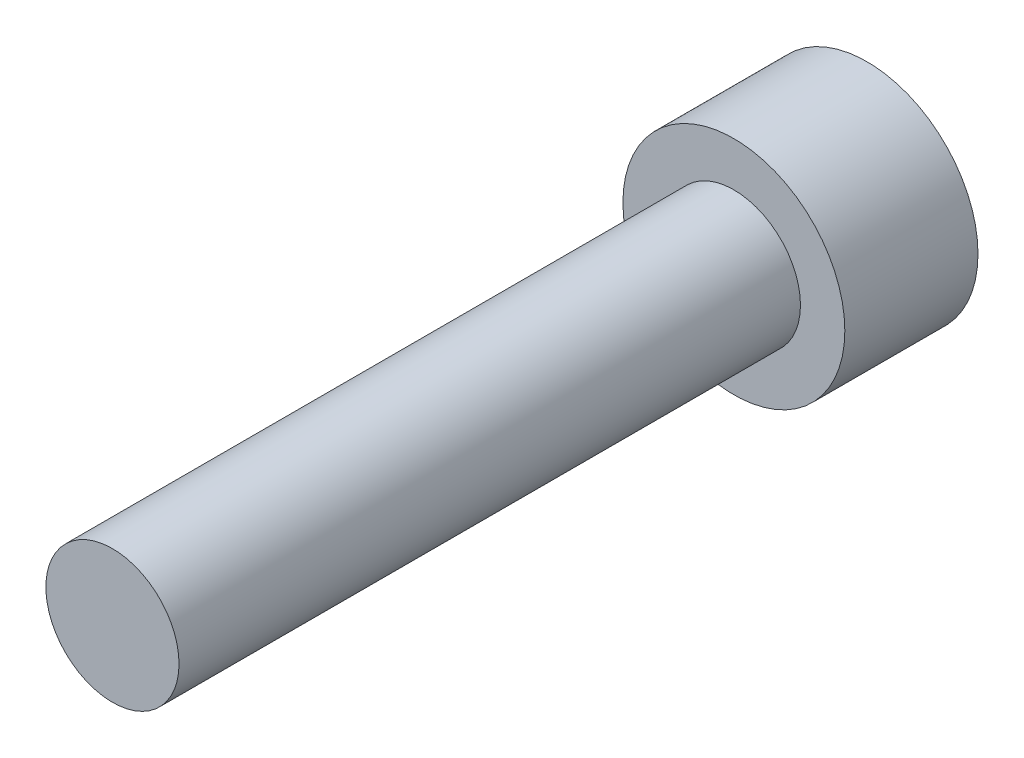
ISO-10303-21;
HEADER;
FILE_DESCRIPTION(('STEP AP214'),'2;1');
FILE_NAME('part.step','',(''),(''),'','','');
FILE_SCHEMA(('AUTOMOTIVE_DESIGN { 1 0 10303 214 1 1 1 1 }'));
ENDSEC;
DATA;
#1=APPLICATION_CONTEXT('core data for automotive mechanical design processes');
#2=APPLICATION_PROTOCOL_DEFINITION('international standard','automotive_design',2000,#1);
#3=PRODUCT_CONTEXT('',#1,'mechanical');
#4=PRODUCT('Part','Part','',(#3));
#5=PRODUCT_RELATED_PRODUCT_CATEGORY('part','',(#4));
#6=PRODUCT_DEFINITION_FORMATION('','',#4);
#7=PRODUCT_DEFINITION_CONTEXT('part definition',#1,'design');
#8=PRODUCT_DEFINITION('design','',#6,#7);
#9=PRODUCT_DEFINITION_SHAPE('','',#8);
#10=(LENGTH_UNIT() NAMED_UNIT(*) SI_UNIT(.MILLI.,.METRE.));
#11=(NAMED_UNIT(*) PLANE_ANGLE_UNIT() SI_UNIT($,.RADIAN.));
#12=(NAMED_UNIT(*) SI_UNIT($,.STERADIAN.) SOLID_ANGLE_UNIT());
#13=UNCERTAINTY_MEASURE_WITH_UNIT(LENGTH_MEASURE(1.E-05),#10,'distance_accuracy_value','');
#14=(GEOMETRIC_REPRESENTATION_CONTEXT(3) GLOBAL_UNCERTAINTY_ASSIGNED_CONTEXT((#13)) GLOBAL_UNIT_ASSIGNED_CONTEXT((#10,
#11,#12)) REPRESENTATION_CONTEXT('',''));
#15=CARTESIAN_POINT('',(0.,0.,0.));
#16=DIRECTION('',(0.,0.,1.));
#17=DIRECTION('',(1.,0.,0.));
#18=AXIS2_PLACEMENT_3D('',#15,#16,#17);
#19=CARTESIAN_POINT('',(0.,0.,6.));
#20=DIRECTION('',(0.,0.,1.));
#21=DIRECTION('',(1.,0.,0.));
#22=AXIS2_PLACEMENT_3D('',#19,#20,#21);
#23=PLANE('',#22);
#24=CARTESIAN_POINT('',(0.,0.,6.));
#25=DIRECTION('',(0.,0.,1.));
#26=DIRECTION('',(1.,0.,0.));
#27=AXIS2_PLACEMENT_3D('',#24,#25,#26);
#28=CIRCLE('',#27,5.);
#29=CARTESIAN_POINT('',(5.,0.,6.));
#30=VERTEX_POINT('',#29);
#31=EDGE_CURVE('E11',#30,#30,#28,.T.);
#32=ORIENTED_EDGE('',*,*,#31,.T.);
#33=EDGE_LOOP('',(#32));
#34=FACE_BOUND('',#33,.T.);
#35=CARTESIAN_POINT('',(0.,0.,6.));
#36=DIRECTION('',(0.,0.,1.));
#37=DIRECTION('',(1.,0.,0.));
#38=AXIS2_PLACEMENT_3D('',#35,#36,#37);
#39=CIRCLE('',#38,3.);
#40=CARTESIAN_POINT('',(3.,0.,6.));
#41=VERTEX_POINT('',#40);
#42=EDGE_CURVE('E139',#41,#41,#39,.T.);
#43=ORIENTED_EDGE('',*,*,#42,.F.);
#44=EDGE_LOOP('',(#43));
#45=FACE_BOUND('',#44,.T.);
#46=ADVANCED_FACE('F37',(#34,#45),#23,.T.);
#47=CARTESIAN_POINT('',(0.,0.,6.));
#48=DIRECTION('',(0.,0.,-1.));
#49=DIRECTION('',(-1.,0.,0.));
#50=AXIS2_PLACEMENT_3D('',#47,#48,#49);
#51=CYLINDRICAL_SURFACE('',#50,5.);
#52=ORIENTED_EDGE('',*,*,#31,.F.);
#53=EDGE_LOOP('',(#52));
#54=FACE_BOUND('',#53,.T.);
#55=CARTESIAN_POINT('',(0.,0.,0.));
#56=DIRECTION('',(0.,0.,1.));
#57=DIRECTION('',(1.,0.,0.));
#58=AXIS2_PLACEMENT_3D('',#55,#56,#57);
#59=CIRCLE('',#58,5.);
#60=CARTESIAN_POINT('',(5.,0.,0.));
#61=VERTEX_POINT('',#60);
#62=EDGE_CURVE('E41',#61,#61,#59,.T.);
#63=ORIENTED_EDGE('',*,*,#62,.T.);
#64=EDGE_LOOP('',(#63));
#65=FACE_BOUND('',#64,.T.);
#66=ADVANCED_FACE('F39',(#54,#65),#51,.T.);
#67=CARTESIAN_POINT('',(0.,0.,0.));
#68=DIRECTION('',(0.,0.,1.));
#69=DIRECTION('',(1.,0.,0.));
#70=AXIS2_PLACEMENT_3D('',#67,#68,#69);
#71=PLANE('',#70);
#72=DIRECTION('',(0.961310652096989,0.275466568143691,0.));
#73=VECTOR('',#72,1.);
#74=CARTESIAN_POINT('',(-2.44462819370027,2.36158950964695,0.));
#75=LINE('',#74,#73);
#76=CARTESIAN_POINT('',(-2.44462819370027,2.36158950964695,0.));
#77=VERTEX_POINT('',#76);
#78=CARTESIAN_POINT('',(0.822882411814956,3.29790487337557,0.));
#79=VERTEX_POINT('',#78);
#80=EDGE_CURVE('E126',#77,#79,#75,.T.);
#81=ORIENTED_EDGE('',*,*,#80,.F.);
#82=DIRECTION('',(0.242094280142741,0.970252729716422,0.));
#83=VECTOR('',#82,1.);
#84=CARTESIAN_POINT('',(-3.26751060551523,-0.936315363728624,0.));
#85=LINE('',#84,#83);
#86=CARTESIAN_POINT('',(-3.26751060551523,-0.936315363728624,0.));
#87=VERTEX_POINT('',#86);
#88=EDGE_CURVE('E52',#87,#77,#85,.T.);
#89=ORIENTED_EDGE('',*,*,#88,.F.);
#90=DIRECTION('',(-0.719216371954248,0.694786161572731,0.));
#91=VECTOR('',#90,1.);
#92=CARTESIAN_POINT('',(-0.822882411814958,-3.29790487337557,0.));
#93=LINE('',#92,#91);
#94=CARTESIAN_POINT('',(-0.822882411814958,-3.29790487337557,0.));
#95=VERTEX_POINT('',#94);
#96=EDGE_CURVE('E135',#95,#87,#93,.T.);
#97=ORIENTED_EDGE('',*,*,#96,.F.);
#98=DIRECTION('',(-0.961310652096989,-0.275466568143691,0.));
#99=VECTOR('',#98,1.);
#100=CARTESIAN_POINT('',(2.44462819370027,-2.36158950964695,0.));
#101=LINE('',#100,#99);
#102=CARTESIAN_POINT('',(2.44462819370027,-2.36158950964695,0.));
#103=VERTEX_POINT('',#102);
#104=EDGE_CURVE('E133',#103,#95,#101,.T.);
#105=ORIENTED_EDGE('',*,*,#104,.F.);
#106=DIRECTION('',(-0.242094280142741,-0.970252729716422,0.));
#107=VECTOR('',#106,1.);
#108=CARTESIAN_POINT('',(3.26751060551522,0.936315363728623,0.));
#109=LINE('',#108,#107);
#110=CARTESIAN_POINT('',(3.26751060551522,0.936315363728623,0.));
#111=VERTEX_POINT('',#110);
#112=EDGE_CURVE('E100',#111,#103,#109,.T.);
#113=ORIENTED_EDGE('',*,*,#112,.F.);
#114=DIRECTION('',(0.719216371954247,-0.694786161572731,0.));
#115=VECTOR('',#114,1.);
#116=CARTESIAN_POINT('',(0.822882411814956,3.29790487337557,0.));
#117=LINE('',#116,#115);
#118=EDGE_CURVE('E129',#79,#111,#117,.T.);
#119=ORIENTED_EDGE('',*,*,#118,.F.);
#120=EDGE_LOOP('',(#81,#89,#97,#105,#113,#119));
#121=FACE_BOUND('',#120,.T.);
#122=ORIENTED_EDGE('',*,*,#62,.F.);
#123=EDGE_LOOP('',(#122));
#124=FACE_BOUND('',#123,.T.);
#125=ADVANCED_FACE('F159',(#121,#124),#71,.F.);
#126=CARTESIAN_POINT('',(0.,0.,34.));
#127=DIRECTION('',(0.,0.,-1.));
#128=DIRECTION('',(-1.,0.,0.));
#129=AXIS2_PLACEMENT_3D('',#126,#127,#128);
#130=CYLINDRICAL_SURFACE('',#129,3.);
#131=CARTESIAN_POINT('',(0.,0.,34.));
#132=DIRECTION('',(0.,0.,1.));
#133=DIRECTION('',(1.,0.,0.));
#134=AXIS2_PLACEMENT_3D('',#131,#132,#133);
#135=CIRCLE('',#134,3.);
#136=CARTESIAN_POINT('',(3.,0.,34.));
#137=VERTEX_POINT('',#136);
#138=EDGE_CURVE('E145',#137,#137,#135,.T.);
#139=ORIENTED_EDGE('',*,*,#138,.F.);
#140=EDGE_LOOP('',(#139));
#141=FACE_BOUND('',#140,.T.);
#142=ORIENTED_EDGE('',*,*,#42,.T.);
#143=EDGE_LOOP('',(#142));
#144=FACE_BOUND('',#143,.T.);
#145=ADVANCED_FACE('F151',(#141,#144),#130,.T.);
#146=CARTESIAN_POINT('',(0.,0.,34.));
#147=DIRECTION('',(0.,0.,1.));
#148=DIRECTION('',(1.,0.,0.));
#149=AXIS2_PLACEMENT_3D('',#146,#147,#148);
#150=PLANE('',#149);
#151=ORIENTED_EDGE('',*,*,#138,.T.);
#152=EDGE_LOOP('',(#151));
#153=FACE_BOUND('',#152,.T.);
#154=ADVANCED_FACE('F168',(#153),#150,.T.);
#155=CARTESIAN_POINT('',(-3.26751060551523,-0.936315363728624,3.));
#156=DIRECTION('',(-0.970252729716422,0.242094280142741,0.));
#157=DIRECTION('',(-0.242094280142741,-0.970252729716422,0.));
#158=AXIS2_PLACEMENT_3D('',#155,#156,#157);
#159=PLANE('',#158);
#160=ORIENTED_EDGE('',*,*,#88,.T.);
#161=DIRECTION('',(0.,0.,-1.));
#162=VECTOR('',#161,1.);
#163=CARTESIAN_POINT('',(-2.44462819370027,2.36158950964695,3.));
#164=LINE('',#163,#162);
#165=CARTESIAN_POINT('',(-2.44462819370027,2.36158950964695,3.));
#166=VERTEX_POINT('',#165);
#167=EDGE_CURVE('E82',#166,#77,#164,.T.);
#168=ORIENTED_EDGE('',*,*,#167,.F.);
#169=DIRECTION('',(0.242094280142741,0.970252729716422,0.));
#170=VECTOR('',#169,1.);
#171=CARTESIAN_POINT('',(-3.26751060551523,-0.936315363728624,3.));
#172=LINE('',#171,#170);
#173=CARTESIAN_POINT('',(-3.26751060551523,-0.936315363728624,3.));
#174=VERTEX_POINT('',#173);
#175=EDGE_CURVE('E137',#174,#166,#172,.T.);
#176=ORIENTED_EDGE('',*,*,#175,.F.);
#177=DIRECTION('',(0.,0.,-1.));
#178=VECTOR('',#177,1.);
#179=CARTESIAN_POINT('',(-3.26751060551523,-0.936315363728624,3.));
#180=LINE('',#179,#178);
#181=EDGE_CURVE('E60',#174,#87,#180,.T.);
#182=ORIENTED_EDGE('',*,*,#181,.T.);
#183=EDGE_LOOP('',(#160,#168,#176,#182));
#184=FACE_BOUND('',#183,.T.);
#185=ADVANCED_FACE('F180',(#184),#159,.F.);
#186=CARTESIAN_POINT('',(-0.822882411814958,-3.29790487337557,3.));
#187=DIRECTION('',(-0.694786161572731,-0.719216371954248,0.));
#188=DIRECTION('',(0.719216371954248,-0.694786161572731,0.));
#189=AXIS2_PLACEMENT_3D('',#186,#187,#188);
#190=PLANE('',#189);
#191=ORIENTED_EDGE('',*,*,#96,.T.);
#192=ORIENTED_EDGE('',*,*,#181,.F.);
#193=DIRECTION('',(-0.719216371954248,0.694786161572731,0.));
#194=VECTOR('',#193,1.);
#195=CARTESIAN_POINT('',(-0.822882411814958,-3.29790487337557,3.));
#196=LINE('',#195,#194);
#197=CARTESIAN_POINT('',(-0.822882411814958,-3.29790487337557,3.));
#198=VERTEX_POINT('',#197);
#199=EDGE_CURVE('E112',#198,#174,#196,.T.);
#200=ORIENTED_EDGE('',*,*,#199,.F.);
#201=DIRECTION('',(0.,0.,-1.));
#202=VECTOR('',#201,1.);
#203=CARTESIAN_POINT('',(-0.822882411814958,-3.29790487337557,3.));
#204=LINE('',#203,#202);
#205=EDGE_CURVE('E104',#198,#95,#204,.T.);
#206=ORIENTED_EDGE('',*,*,#205,.T.);
#207=EDGE_LOOP('',(#191,#192,#200,#206));
#208=FACE_BOUND('',#207,.T.);
#209=ADVANCED_FACE('F182',(#208),#190,.F.);
#210=CARTESIAN_POINT('',(2.44462819370027,-2.36158950964695,3.));
#211=DIRECTION('',(0.275466568143691,-0.961310652096988,0.));
#212=DIRECTION('',(0.961310652096989,0.275466568143691,0.));
#213=AXIS2_PLACEMENT_3D('',#210,#211,#212);
#214=PLANE('',#213);
#215=ORIENTED_EDGE('',*,*,#104,.T.);
#216=ORIENTED_EDGE('',*,*,#205,.F.);
#217=DIRECTION('',(-0.961310652096989,-0.275466568143691,0.));
#218=VECTOR('',#217,1.);
#219=CARTESIAN_POINT('',(2.44462819370027,-2.36158950964695,3.));
#220=LINE('',#219,#218);
#221=CARTESIAN_POINT('',(2.44462819370027,-2.36158950964695,3.));
#222=VERTEX_POINT('',#221);
#223=EDGE_CURVE('E108',#222,#198,#220,.T.);
#224=ORIENTED_EDGE('',*,*,#223,.F.);
#225=DIRECTION('',(0.,0.,-1.));
#226=VECTOR('',#225,1.);
#227=CARTESIAN_POINT('',(2.44462819370027,-2.36158950964695,3.));
#228=LINE('',#227,#226);
#229=EDGE_CURVE('E93',#222,#103,#228,.T.);
#230=ORIENTED_EDGE('',*,*,#229,.T.);
#231=EDGE_LOOP('',(#215,#216,#224,#230));
#232=FACE_BOUND('',#231,.T.);
#233=ADVANCED_FACE('F109',(#232),#214,.F.);
#234=CARTESIAN_POINT('',(3.26751060551522,0.936315363728623,3.));
#235=DIRECTION('',(0.970252729716422,-0.242094280142741,0.));
#236=DIRECTION('',(0.242094280142741,0.970252729716422,0.));
#237=AXIS2_PLACEMENT_3D('',#234,#235,#236);
#238=PLANE('',#237);
#239=ORIENTED_EDGE('',*,*,#112,.T.);
#240=ORIENTED_EDGE('',*,*,#229,.F.);
#241=DIRECTION('',(-0.242094280142741,-0.970252729716422,0.));
#242=VECTOR('',#241,1.);
#243=CARTESIAN_POINT('',(3.26751060551522,0.936315363728623,3.));
#244=LINE('',#243,#242);
#245=CARTESIAN_POINT('',(3.26751060551522,0.936315363728623,3.));
#246=VERTEX_POINT('',#245);
#247=EDGE_CURVE('E97',#246,#222,#244,.T.);
#248=ORIENTED_EDGE('',*,*,#247,.F.);
#249=DIRECTION('',(0.,0.,-1.));
#250=VECTOR('',#249,1.);
#251=CARTESIAN_POINT('',(3.26751060551522,0.936315363728623,3.));
#252=LINE('',#251,#250);
#253=EDGE_CURVE('E105',#246,#111,#252,.T.);
#254=ORIENTED_EDGE('',*,*,#253,.T.);
#255=EDGE_LOOP('',(#239,#240,#248,#254));
#256=FACE_BOUND('',#255,.T.);
#257=ADVANCED_FACE('F95',(#256),#238,.F.);
#258=CARTESIAN_POINT('',(0.822882411814956,3.29790487337557,3.));
#259=DIRECTION('',(0.694786161572731,0.719216371954248,0.));
#260=DIRECTION('',(-0.719216371954248,0.694786161572731,0.));
#261=AXIS2_PLACEMENT_3D('',#258,#259,#260);
#262=PLANE('',#261);
#263=ORIENTED_EDGE('',*,*,#118,.T.);
#264=ORIENTED_EDGE('',*,*,#253,.F.);
#265=DIRECTION('',(0.719216371954247,-0.694786161572731,0.));
#266=VECTOR('',#265,1.);
#267=CARTESIAN_POINT('',(0.822882411814956,3.29790487337557,3.));
#268=LINE('',#267,#266);
#269=CARTESIAN_POINT('',(0.822882411814956,3.29790487337557,3.));
#270=VERTEX_POINT('',#269);
#271=EDGE_CURVE('E118',#270,#246,#268,.T.);
#272=ORIENTED_EDGE('',*,*,#271,.F.);
#273=DIRECTION('',(0.,0.,-1.));
#274=VECTOR('',#273,1.);
#275=CARTESIAN_POINT('',(0.822882411814956,3.29790487337557,3.));
#276=LINE('',#275,#274);
#277=EDGE_CURVE('E142',#270,#79,#276,.T.);
#278=ORIENTED_EDGE('',*,*,#277,.T.);
#279=EDGE_LOOP('',(#263,#264,#272,#278));
#280=FACE_BOUND('',#279,.T.);
#281=ADVANCED_FACE('F193',(#280),#262,.F.);
#282=CARTESIAN_POINT('',(-2.44462819370027,2.36158950964695,3.));
#283=DIRECTION('',(-0.275466568143691,0.961310652096988,0.));
#284=DIRECTION('',(-0.961310652096989,-0.275466568143691,0.));
#285=AXIS2_PLACEMENT_3D('',#282,#283,#284);
#286=PLANE('',#285);
#287=ORIENTED_EDGE('',*,*,#80,.T.);
#288=ORIENTED_EDGE('',*,*,#277,.F.);
#289=DIRECTION('',(0.961310652096989,0.275466568143691,0.));
#290=VECTOR('',#289,1.);
#291=CARTESIAN_POINT('',(-2.44462819370027,2.36158950964695,3.));
#292=LINE('',#291,#290);
#293=EDGE_CURVE('E120',#166,#270,#292,.T.);
#294=ORIENTED_EDGE('',*,*,#293,.F.);
#295=ORIENTED_EDGE('',*,*,#167,.T.);
#296=EDGE_LOOP('',(#287,#288,#294,#295));
#297=FACE_BOUND('',#296,.T.);
#298=ADVANCED_FACE('F178',(#297),#286,.F.);
#299=CARTESIAN_POINT('',(0.,0.,3.));
#300=DIRECTION('',(0.,0.,-1.));
#301=DIRECTION('',(-1.,0.,0.));
#302=AXIS2_PLACEMENT_3D('',#299,#300,#301);
#303=PLANE('',#302);
#304=ORIENTED_EDGE('',*,*,#175,.T.);
#305=ORIENTED_EDGE('',*,*,#293,.T.);
#306=ORIENTED_EDGE('',*,*,#271,.T.);
#307=ORIENTED_EDGE('',*,*,#247,.T.);
#308=ORIENTED_EDGE('',*,*,#223,.T.);
#309=ORIENTED_EDGE('',*,*,#199,.T.);
#310=EDGE_LOOP('',(#304,#305,#306,#307,#308,#309));
#311=FACE_BOUND('',#310,.T.);
#312=ADVANCED_FACE('F115',(#311),#303,.T.);
#313=CLOSED_SHELL('',(#46,#66,#125,#145,#154,#185,#209,#233,#257,#281,#298,#312));
#314=MANIFOLD_SOLID_BREP('B2',#313);
#315=ADVANCED_BREP_SHAPE_REPRESENTATION('',(#18,#314),#14);
#316=SHAPE_DEFINITION_REPRESENTATION(#9,#315);
ENDSEC;
END-ISO-10303-21;
